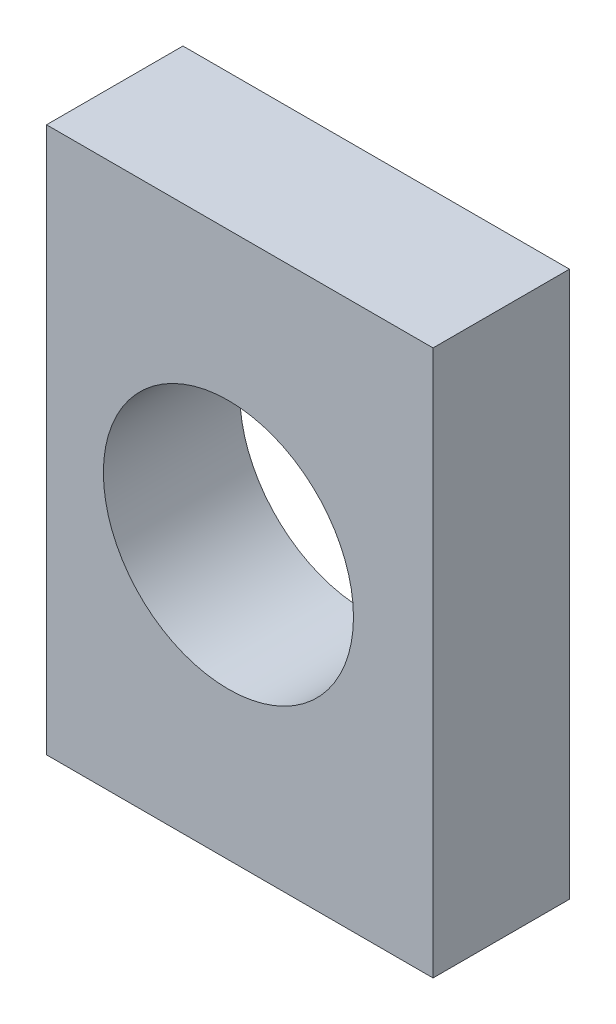
ISO-10303-21;
HEADER;
FILE_DESCRIPTION(('STEP AP214'),'2;1');
FILE_NAME('part.step','',(''),(''),'','','');
FILE_SCHEMA(('AUTOMOTIVE_DESIGN { 1 0 10303 214 1 1 1 1 }'));
ENDSEC;
DATA;
#1=APPLICATION_CONTEXT('core data for automotive mechanical design processes');
#2=APPLICATION_PROTOCOL_DEFINITION('international standard','automotive_design',2000,#1);
#3=PRODUCT_CONTEXT('',#1,'mechanical');
#4=PRODUCT('Part','Part','',(#3));
#5=PRODUCT_RELATED_PRODUCT_CATEGORY('part','',(#4));
#6=PRODUCT_DEFINITION_FORMATION('','',#4);
#7=PRODUCT_DEFINITION_CONTEXT('part definition',#1,'design');
#8=PRODUCT_DEFINITION('design','',#6,#7);
#9=PRODUCT_DEFINITION_SHAPE('','',#8);
#10=(LENGTH_UNIT() NAMED_UNIT(*) SI_UNIT(.MILLI.,.METRE.));
#11=(NAMED_UNIT(*) PLANE_ANGLE_UNIT() SI_UNIT($,.RADIAN.));
#12=(NAMED_UNIT(*) SI_UNIT($,.STERADIAN.) SOLID_ANGLE_UNIT());
#13=UNCERTAINTY_MEASURE_WITH_UNIT(LENGTH_MEASURE(1.E-05),#10,'distance_accuracy_value','');
#14=(GEOMETRIC_REPRESENTATION_CONTEXT(3) GLOBAL_UNCERTAINTY_ASSIGNED_CONTEXT((#13)) GLOBAL_UNIT_ASSIGNED_CONTEXT((#10,
#11,#12)) REPRESENTATION_CONTEXT('',''));
#15=CARTESIAN_POINT('',(0.,0.,0.));
#16=DIRECTION('',(0.,0.,1.));
#17=DIRECTION('',(1.,0.,0.));
#18=AXIS2_PLACEMENT_3D('',#15,#16,#17);
#19=CARTESIAN_POINT('',(0.,0.,3.));
#20=DIRECTION('',(0.,0.,1.));
#21=DIRECTION('',(1.,0.,0.));
#22=AXIS2_PLACEMENT_3D('',#19,#20,#21);
#23=PLANE('',#22);
#24=DIRECTION('',(0.,-1.,0.));
#25=VECTOR('',#24,1.);
#26=CARTESIAN_POINT('',(94.5,6.,3.));
#27=LINE('',#26,#25);
#28=CARTESIAN_POINT('',(94.5,6.,3.));
#29=VERTEX_POINT('',#28);
#30=CARTESIAN_POINT('',(94.5,-6.,3.));
#31=VERTEX_POINT('',#30);
#32=EDGE_CURVE('E98',#29,#31,#27,.T.);
#33=ORIENTED_EDGE('',*,*,#32,.T.);
#34=DIRECTION('',(1.,0.,0.));
#35=VECTOR('',#34,1.);
#36=CARTESIAN_POINT('',(94.5,-6.,3.));
#37=LINE('',#36,#35);
#38=CARTESIAN_POINT('',(103.,-6.,3.));
#39=VERTEX_POINT('',#38);
#40=EDGE_CURVE('E93',#31,#39,#37,.T.);
#41=ORIENTED_EDGE('',*,*,#40,.T.);
#42=DIRECTION('',(0.,1.,0.));
#43=VECTOR('',#42,1.);
#44=CARTESIAN_POINT('',(103.,-6.,3.));
#45=LINE('',#44,#43);
#46=CARTESIAN_POINT('',(103.,6.,3.));
#47=VERTEX_POINT('',#46);
#48=EDGE_CURVE('E96',#39,#47,#45,.T.);
#49=ORIENTED_EDGE('',*,*,#48,.T.);
#50=DIRECTION('',(-1.,0.,0.));
#51=VECTOR('',#50,1.);
#52=CARTESIAN_POINT('',(103.,6.,3.));
#53=LINE('',#52,#51);
#54=EDGE_CURVE('E63',#47,#29,#53,.T.);
#55=ORIENTED_EDGE('',*,*,#54,.T.);
#56=EDGE_LOOP('',(#33,#41,#49,#55));
#57=FACE_BOUND('',#56,.T.);
#58=CARTESIAN_POINT('',(98.5,0.,3.));
#59=DIRECTION('',(0.,0.,1.));
#60=DIRECTION('',(1.,0.,0.));
#61=AXIS2_PLACEMENT_3D('',#58,#59,#60);
#62=CIRCLE('',#61,2.75);
#63=CARTESIAN_POINT('',(101.25,0.,3.));
#64=VERTEX_POINT('',#63);
#65=EDGE_CURVE('E120',#64,#64,#62,.T.);
#66=ORIENTED_EDGE('',*,*,#65,.F.);
#67=EDGE_LOOP('',(#66));
#68=FACE_BOUND('',#67,.T.);
#69=ADVANCED_FACE('F45',(#57,#68),#23,.T.);
#70=CARTESIAN_POINT('',(0.,0.,0.));
#71=DIRECTION('',(0.,0.,1.));
#72=DIRECTION('',(1.,0.,0.));
#73=AXIS2_PLACEMENT_3D('',#70,#71,#72);
#74=PLANE('',#73);
#75=DIRECTION('',(0.,-1.,0.));
#76=VECTOR('',#75,1.);
#77=CARTESIAN_POINT('',(94.5,6.,0.));
#78=LINE('',#77,#76);
#79=CARTESIAN_POINT('',(94.5,6.,0.));
#80=VERTEX_POINT('',#79);
#81=CARTESIAN_POINT('',(94.5,-6.,0.));
#82=VERTEX_POINT('',#81);
#83=EDGE_CURVE('E116',#80,#82,#78,.T.);
#84=ORIENTED_EDGE('',*,*,#83,.F.);
#85=DIRECTION('',(-1.,0.,0.));
#86=VECTOR('',#85,1.);
#87=CARTESIAN_POINT('',(103.,6.,0.));
#88=LINE('',#87,#86);
#89=CARTESIAN_POINT('',(103.,6.,0.));
#90=VERTEX_POINT('',#89);
#91=EDGE_CURVE('E86',#90,#80,#88,.T.);
#92=ORIENTED_EDGE('',*,*,#91,.F.);
#93=DIRECTION('',(0.,1.,0.));
#94=VECTOR('',#93,1.);
#95=CARTESIAN_POINT('',(103.,-6.,0.));
#96=LINE('',#95,#94);
#97=CARTESIAN_POINT('',(103.,-6.,0.));
#98=VERTEX_POINT('',#97);
#99=EDGE_CURVE('E80',#98,#90,#96,.T.);
#100=ORIENTED_EDGE('',*,*,#99,.F.);
#101=DIRECTION('',(1.,0.,0.));
#102=VECTOR('',#101,1.);
#103=CARTESIAN_POINT('',(94.5,-6.,0.));
#104=LINE('',#103,#102);
#105=EDGE_CURVE('E103',#82,#98,#104,.T.);
#106=ORIENTED_EDGE('',*,*,#105,.F.);
#107=EDGE_LOOP('',(#84,#92,#100,#106));
#108=FACE_BOUND('',#107,.T.);
#109=CARTESIAN_POINT('',(98.5,0.,0.));
#110=DIRECTION('',(0.,0.,1.));
#111=DIRECTION('',(1.,0.,0.));
#112=AXIS2_PLACEMENT_3D('',#109,#110,#111);
#113=CIRCLE('',#112,2.75);
#114=CARTESIAN_POINT('',(101.25,0.,0.));
#115=VERTEX_POINT('',#114);
#116=EDGE_CURVE('E137',#115,#115,#113,.T.);
#117=ORIENTED_EDGE('',*,*,#116,.T.);
#118=EDGE_LOOP('',(#117));
#119=FACE_BOUND('',#118,.T.);
#120=ADVANCED_FACE('F132',(#108,#119),#74,.F.);
#121=CARTESIAN_POINT('',(94.5,6.,3.));
#122=DIRECTION('',(1.,0.,0.));
#123=DIRECTION('',(0.,0.,-1.));
#124=AXIS2_PLACEMENT_3D('',#121,#122,#123);
#125=PLANE('',#124);
#126=ORIENTED_EDGE('',*,*,#83,.T.);
#127=DIRECTION('',(0.,0.,-1.));
#128=VECTOR('',#127,1.);
#129=CARTESIAN_POINT('',(94.5,-6.,3.));
#130=LINE('',#129,#128);
#131=EDGE_CURVE('E11',#31,#82,#130,.T.);
#132=ORIENTED_EDGE('',*,*,#131,.F.);
#133=ORIENTED_EDGE('',*,*,#32,.F.);
#134=DIRECTION('',(0.,0.,-1.));
#135=VECTOR('',#134,1.);
#136=CARTESIAN_POINT('',(94.5,6.,3.));
#137=LINE('',#136,#135);
#138=EDGE_CURVE('E112',#29,#80,#137,.T.);
#139=ORIENTED_EDGE('',*,*,#138,.T.);
#140=EDGE_LOOP('',(#126,#132,#133,#139));
#141=FACE_BOUND('',#140,.T.);
#142=ADVANCED_FACE('F47',(#141),#125,.F.);
#143=CARTESIAN_POINT('',(94.5,-6.,3.));
#144=DIRECTION('',(0.,1.,0.));
#145=DIRECTION('',(0.,0.,1.));
#146=AXIS2_PLACEMENT_3D('',#143,#144,#145);
#147=PLANE('',#146);
#148=ORIENTED_EDGE('',*,*,#105,.T.);
#149=DIRECTION('',(0.,0.,-1.));
#150=VECTOR('',#149,1.);
#151=CARTESIAN_POINT('',(103.,-6.,3.));
#152=LINE('',#151,#150);
#153=EDGE_CURVE('E55',#39,#98,#152,.T.);
#154=ORIENTED_EDGE('',*,*,#153,.F.);
#155=ORIENTED_EDGE('',*,*,#40,.F.);
#156=ORIENTED_EDGE('',*,*,#131,.T.);
#157=EDGE_LOOP('',(#148,#154,#155,#156));
#158=FACE_BOUND('',#157,.T.);
#159=ADVANCED_FACE('F102',(#158),#147,.F.);
#160=CARTESIAN_POINT('',(103.,-6.,3.));
#161=DIRECTION('',(-1.,0.,0.));
#162=DIRECTION('',(0.,0.,1.));
#163=AXIS2_PLACEMENT_3D('',#160,#161,#162);
#164=PLANE('',#163);
#165=ORIENTED_EDGE('',*,*,#99,.T.);
#166=DIRECTION('',(0.,0.,-1.));
#167=VECTOR('',#166,1.);
#168=CARTESIAN_POINT('',(103.,6.,3.));
#169=LINE('',#168,#167);
#170=EDGE_CURVE('E105',#47,#90,#169,.T.);
#171=ORIENTED_EDGE('',*,*,#170,.F.);
#172=ORIENTED_EDGE('',*,*,#48,.F.);
#173=ORIENTED_EDGE('',*,*,#153,.T.);
#174=EDGE_LOOP('',(#165,#171,#172,#173));
#175=FACE_BOUND('',#174,.T.);
#176=ADVANCED_FACE('F106',(#175),#164,.F.);
#177=CARTESIAN_POINT('',(103.,6.,3.));
#178=DIRECTION('',(0.,-1.,0.));
#179=DIRECTION('',(0.,0.,-1.));
#180=AXIS2_PLACEMENT_3D('',#177,#178,#179);
#181=PLANE('',#180);
#182=ORIENTED_EDGE('',*,*,#91,.T.);
#183=ORIENTED_EDGE('',*,*,#138,.F.);
#184=ORIENTED_EDGE('',*,*,#54,.F.);
#185=ORIENTED_EDGE('',*,*,#170,.T.);
#186=EDGE_LOOP('',(#182,#183,#184,#185));
#187=FACE_BOUND('',#186,.T.);
#188=ADVANCED_FACE('F129',(#187),#181,.F.);
#189=CARTESIAN_POINT('',(98.5,0.,3.));
#190=DIRECTION('',(0.,0.,-1.));
#191=DIRECTION('',(-1.,0.,0.));
#192=AXIS2_PLACEMENT_3D('',#189,#190,#191);
#193=CYLINDRICAL_SURFACE('',#192,2.75);
#194=ORIENTED_EDGE('',*,*,#65,.T.);
#195=EDGE_LOOP('',(#194));
#196=FACE_BOUND('',#195,.T.);
#197=ORIENTED_EDGE('',*,*,#116,.F.);
#198=EDGE_LOOP('',(#197));
#199=FACE_BOUND('',#198,.T.);
#200=ADVANCED_FACE('F144',(#196,#199),#193,.F.);
#201=CLOSED_SHELL('',(#69,#120,#142,#159,#176,#188,#200));
#202=MANIFOLD_SOLID_BREP('B2',#201);
#203=ADVANCED_BREP_SHAPE_REPRESENTATION('',(#18,#202),#14);
#204=SHAPE_DEFINITION_REPRESENTATION(#9,#203);
ENDSEC;
END-ISO-10303-21;
